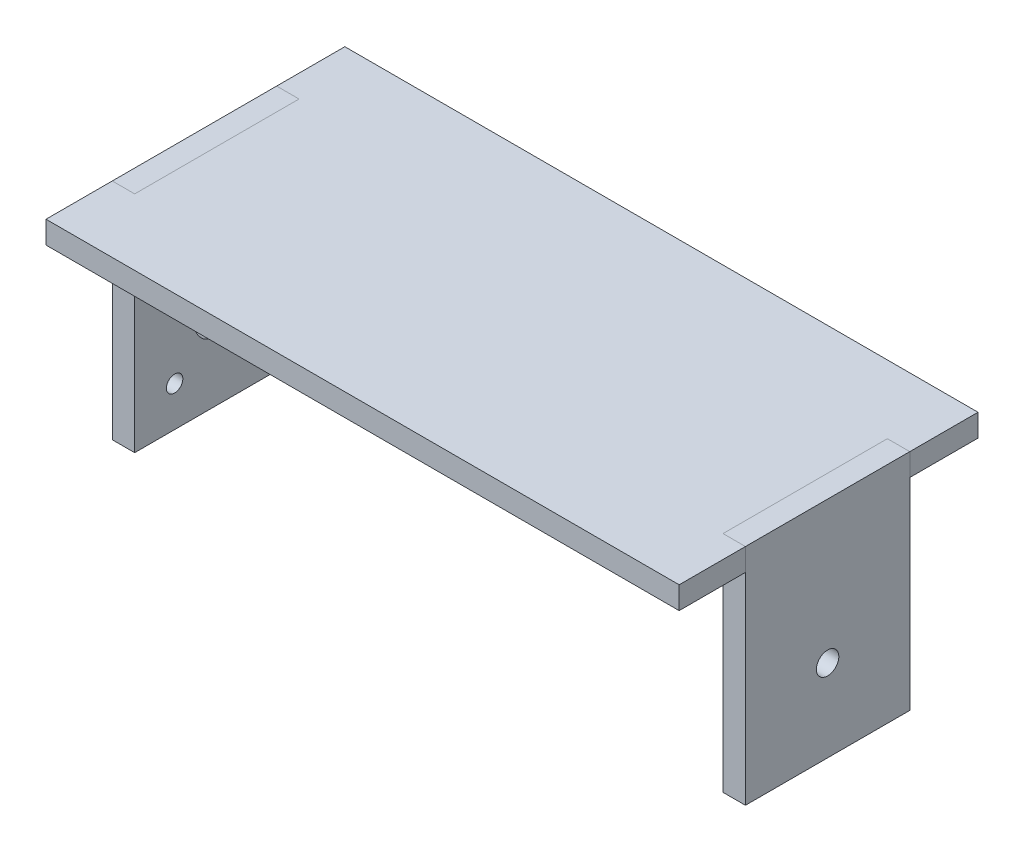
ISO-10303-21;
HEADER;
FILE_DESCRIPTION(('STEP AP214'),'2;1');
FILE_NAME('part.step','',(''),(''),'','','');
FILE_SCHEMA(('AUTOMOTIVE_DESIGN { 1 0 10303 214 1 1 1 1 }'));
ENDSEC;
DATA;
#1=APPLICATION_CONTEXT('core data for automotive mechanical design processes');
#2=APPLICATION_PROTOCOL_DEFINITION('international standard','automotive_design',2000,#1);
#3=PRODUCT_CONTEXT('',#1,'mechanical');
#4=PRODUCT('Part','Part','',(#3));
#5=PRODUCT_RELATED_PRODUCT_CATEGORY('part','',(#4));
#6=PRODUCT_DEFINITION_FORMATION('','',#4);
#7=PRODUCT_DEFINITION_CONTEXT('part definition',#1,'design');
#8=PRODUCT_DEFINITION('design','',#6,#7);
#9=PRODUCT_DEFINITION_SHAPE('','',#8);
#10=(LENGTH_UNIT() NAMED_UNIT(*) SI_UNIT(.MILLI.,.METRE.));
#11=(NAMED_UNIT(*) PLANE_ANGLE_UNIT() SI_UNIT($,.RADIAN.));
#12=(NAMED_UNIT(*) SI_UNIT($,.STERADIAN.) SOLID_ANGLE_UNIT());
#13=UNCERTAINTY_MEASURE_WITH_UNIT(LENGTH_MEASURE(1.E-05),#10,'distance_accuracy_value','');
#14=(GEOMETRIC_REPRESENTATION_CONTEXT(3) GLOBAL_UNCERTAINTY_ASSIGNED_CONTEXT((#13)) GLOBAL_UNIT_ASSIGNED_CONTEXT((#10,
#11,#12)) REPRESENTATION_CONTEXT('',''));
#15=CARTESIAN_POINT('',(0.,0.,0.));
#16=DIRECTION('',(0.,0.,1.));
#17=DIRECTION('',(1.,0.,0.));
#18=AXIS2_PLACEMENT_3D('',#15,#16,#17);
#19=CARTESIAN_POINT('',(0.,-30.,11.));
#20=DIRECTION('',(0.,0.,1.));
#21=DIRECTION('',(-1.,0.,0.));
#22=AXIS2_PLACEMENT_3D('',#19,#20,#21);
#23=PLANE('',#22);
#24=DIRECTION('',(-1.,0.,0.));
#25=VECTOR('',#24,1.);
#26=CARTESIAN_POINT('',(0.,0.,11.));
#27=LINE('',#26,#25);
#28=CARTESIAN_POINT('',(42.1266181229774,0.,11.));
#29=VERTEX_POINT('',#28);
#30=CARTESIAN_POINT('',(39.1266181229774,0.,11.));
#31=VERTEX_POINT('',#30);
#32=EDGE_CURVE('E110',#29,#31,#27,.T.);
#33=ORIENTED_EDGE('',*,*,#32,.T.);
#34=DIRECTION('',(0.,1.,0.));
#35=VECTOR('',#34,1.);
#36=CARTESIAN_POINT('',(39.1266181229774,-30.,11.));
#37=LINE('',#36,#35);
#38=CARTESIAN_POINT('',(39.1266181229774,-30.,11.));
#39=VERTEX_POINT('',#38);
#40=EDGE_CURVE('E49',#39,#31,#37,.T.);
#41=ORIENTED_EDGE('',*,*,#40,.F.);
#42=DIRECTION('',(-1.,0.,0.));
#43=VECTOR('',#42,1.);
#44=CARTESIAN_POINT('',(0.,-30.,11.));
#45=LINE('',#44,#43);
#46=CARTESIAN_POINT('',(42.1266181229774,-30.,11.));
#47=VERTEX_POINT('',#46);
#48=EDGE_CURVE('E99',#47,#39,#45,.T.);
#49=ORIENTED_EDGE('',*,*,#48,.F.);
#50=DIRECTION('',(0.,1.,0.));
#51=VECTOR('',#50,1.);
#52=CARTESIAN_POINT('',(42.1266181229774,-30.,11.));
#53=LINE('',#52,#51);
#54=EDGE_CURVE('E12',#47,#29,#53,.T.);
#55=ORIENTED_EDGE('',*,*,#54,.T.);
#56=EDGE_LOOP('',(#33,#41,#49,#55));
#57=FACE_BOUND('',#56,.T.);
#58=ADVANCED_FACE('F46',(#57),#23,.T.);
#59=CARTESIAN_POINT('',(42.1266181229774,-30.,0.));
#60=DIRECTION('',(-1.,0.,0.));
#61=DIRECTION('',(0.,0.,-1.));
#62=AXIS2_PLACEMENT_3D('',#59,#60,#61);
#63=PLANE('',#62);
#64=CARTESIAN_POINT('',(42.1266181229774,-19.,0.));
#65=DIRECTION('',(-1.,0.,0.));
#66=DIRECTION('',(0.,0.,1.));
#67=AXIS2_PLACEMENT_3D('',#64,#65,#66);
#68=CIRCLE('',#67,1.5);
#69=CARTESIAN_POINT('',(42.1266181229774,-19.,1.49999999999999));
#70=VERTEX_POINT('',#69);
#71=EDGE_CURVE('E125',#70,#70,#68,.T.);
#72=ORIENTED_EDGE('',*,*,#71,.T.);
#73=EDGE_LOOP('',(#72));
#74=FACE_BOUND('',#73,.T.);
#75=DIRECTION('',(0.,0.,-1.));
#76=VECTOR('',#75,1.);
#77=CARTESIAN_POINT('',(42.1266181229774,0.,0.));
#78=LINE('',#77,#76);
#79=CARTESIAN_POINT('',(42.1266181229774,0.,-11.));
#80=VERTEX_POINT('',#79);
#81=EDGE_CURVE('E87',#29,#80,#78,.T.);
#82=ORIENTED_EDGE('',*,*,#81,.F.);
#83=ORIENTED_EDGE('',*,*,#54,.F.);
#84=DIRECTION('',(0.,0.,-1.));
#85=VECTOR('',#84,1.);
#86=CARTESIAN_POINT('',(42.1266181229774,-30.,0.));
#87=LINE('',#86,#85);
#88=CARTESIAN_POINT('',(42.1266181229774,-30.,-11.));
#89=VERTEX_POINT('',#88);
#90=EDGE_CURVE('E64',#47,#89,#87,.T.);
#91=ORIENTED_EDGE('',*,*,#90,.T.);
#92=DIRECTION('',(0.,1.,0.));
#93=VECTOR('',#92,1.);
#94=CARTESIAN_POINT('',(42.1266181229774,-30.,-11.));
#95=LINE('',#94,#93);
#96=EDGE_CURVE('E55',#89,#80,#95,.T.);
#97=ORIENTED_EDGE('',*,*,#96,.T.);
#98=EDGE_LOOP('',(#82,#83,#91,#97));
#99=FACE_BOUND('',#98,.T.);
#100=ADVANCED_FACE('F117',(#74,#99),#63,.F.);
#101=CARTESIAN_POINT('',(0.,-30.,-11.));
#102=DIRECTION('',(0.,0.,1.));
#103=DIRECTION('',(-1.,0.,0.));
#104=AXIS2_PLACEMENT_3D('',#101,#102,#103);
#105=PLANE('',#104);
#106=DIRECTION('',(-1.,0.,0.));
#107=VECTOR('',#106,1.);
#108=CARTESIAN_POINT('',(0.,0.,-11.));
#109=LINE('',#108,#107);
#110=CARTESIAN_POINT('',(39.1266181229774,0.,-11.));
#111=VERTEX_POINT('',#110);
#112=EDGE_CURVE('E81',#80,#111,#109,.T.);
#113=ORIENTED_EDGE('',*,*,#112,.F.);
#114=ORIENTED_EDGE('',*,*,#96,.F.);
#115=DIRECTION('',(-1.,0.,0.));
#116=VECTOR('',#115,1.);
#117=CARTESIAN_POINT('',(0.,-30.,-11.));
#118=LINE('',#117,#116);
#119=CARTESIAN_POINT('',(39.1266181229774,-30.,-11.));
#120=VERTEX_POINT('',#119);
#121=EDGE_CURVE('E97',#89,#120,#118,.T.);
#122=ORIENTED_EDGE('',*,*,#121,.T.);
#123=DIRECTION('',(0.,1.,0.));
#124=VECTOR('',#123,1.);
#125=CARTESIAN_POINT('',(39.1266181229774,-30.,-11.));
#126=LINE('',#125,#124);
#127=EDGE_CURVE('E102',#120,#111,#126,.T.);
#128=ORIENTED_EDGE('',*,*,#127,.T.);
#129=EDGE_LOOP('',(#113,#114,#122,#128));
#130=FACE_BOUND('',#129,.T.);
#131=ADVANCED_FACE('F105',(#130),#105,.F.);
#132=CARTESIAN_POINT('',(39.1266181229774,-30.,0.));
#133=DIRECTION('',(-1.,0.,0.));
#134=DIRECTION('',(0.,0.,-1.));
#135=AXIS2_PLACEMENT_3D('',#132,#133,#134);
#136=PLANE('',#135);
#137=CARTESIAN_POINT('',(39.1266181229774,-19.,0.));
#138=DIRECTION('',(1.,0.,0.));
#139=DIRECTION('',(0.,0.,-1.));
#140=AXIS2_PLACEMENT_3D('',#137,#138,#139);
#141=CIRCLE('',#140,1.5);
#142=CARTESIAN_POINT('',(39.1266181229774,-19.,1.49999999999999));
#143=VERTEX_POINT('',#142);
#144=EDGE_CURVE('E113',#143,#143,#141,.F.);
#145=ORIENTED_EDGE('',*,*,#144,.F.);
#146=EDGE_LOOP('',(#145));
#147=FACE_BOUND('',#146,.T.);
#148=DIRECTION('',(0.,0.,-1.));
#149=VECTOR('',#148,1.);
#150=CARTESIAN_POINT('',(39.1266181229774,0.,0.));
#151=LINE('',#150,#149);
#152=EDGE_CURVE('E104',#31,#111,#151,.T.);
#153=ORIENTED_EDGE('',*,*,#152,.T.);
#154=ORIENTED_EDGE('',*,*,#127,.F.);
#155=DIRECTION('',(0.,0.,-1.));
#156=VECTOR('',#155,1.);
#157=CARTESIAN_POINT('',(39.1266181229774,-30.,0.));
#158=LINE('',#157,#156);
#159=EDGE_CURVE('E94',#39,#120,#158,.T.);
#160=ORIENTED_EDGE('',*,*,#159,.F.);
#161=ORIENTED_EDGE('',*,*,#40,.T.);
#162=EDGE_LOOP('',(#153,#154,#160,#161));
#163=FACE_BOUND('',#162,.T.);
#164=ADVANCED_FACE('F103',(#147,#163),#136,.T.);
#165=CARTESIAN_POINT('',(0.,-30.,0.));
#166=DIRECTION('',(0.,1.,0.));
#167=DIRECTION('',(0.,0.,-1.));
#168=AXIS2_PLACEMENT_3D('',#165,#166,#167);
#169=PLANE('',#168);
#170=ORIENTED_EDGE('',*,*,#48,.T.);
#171=ORIENTED_EDGE('',*,*,#159,.T.);
#172=ORIENTED_EDGE('',*,*,#121,.F.);
#173=ORIENTED_EDGE('',*,*,#90,.F.);
#174=EDGE_LOOP('',(#170,#171,#172,#173));
#175=FACE_BOUND('',#174,.T.);
#176=ADVANCED_FACE('F95',(#175),#169,.F.);
#177=CARTESIAN_POINT('',(0.,0.,0.));
#178=DIRECTION('',(0.,1.,0.));
#179=DIRECTION('',(0.,0.,-1.));
#180=AXIS2_PLACEMENT_3D('',#177,#178,#179);
#181=PLANE('',#180);
#182=ORIENTED_EDGE('',*,*,#32,.F.);
#183=ORIENTED_EDGE('',*,*,#81,.T.);
#184=ORIENTED_EDGE('',*,*,#112,.T.);
#185=ORIENTED_EDGE('',*,*,#152,.F.);
#186=EDGE_LOOP('',(#182,#183,#184,#185));
#187=FACE_BOUND('',#186,.T.);
#188=ADVANCED_FACE('F120',(#187),#181,.T.);
#189=CARTESIAN_POINT('',(34.8839774358581,-19.,0.));
#190=DIRECTION('',(1.,0.,0.));
#191=DIRECTION('',(0.,0.,1.));
#192=AXIS2_PLACEMENT_3D('',#189,#190,#191);
#193=CYLINDRICAL_SURFACE('',#192,1.5);
#194=CARTESIAN_POINT('',(42.1266181229774,-19.,1.49999999999999));
#195=CARTESIAN_POINT('',(42.0953681229774,-19.,1.49999999999999));
#196=CARTESIAN_POINT('',(42.0641181229774,-19.,1.49999999999999));
#197=CARTESIAN_POINT('',(42.0016181229774,-19.,1.49999999999999));
#198=CARTESIAN_POINT('',(41.9703681229774,-19.,1.49999999999999));
#199=CARTESIAN_POINT('',(41.9078681229774,-19.,1.49999999999999));
#200=CARTESIAN_POINT('',(41.8766181229774,-19.,1.49999999999999));
#201=CARTESIAN_POINT('',(41.8141181229774,-19.,1.49999999999999));
#202=CARTESIAN_POINT('',(41.7828681229774,-19.,1.49999999999999));
#203=CARTESIAN_POINT('',(41.7203681229774,-19.,1.49999999999999));
#204=CARTESIAN_POINT('',(41.6891181229774,-19.,1.49999999999999));
#205=CARTESIAN_POINT('',(41.6266181229774,-19.,1.49999999999999));
#206=CARTESIAN_POINT('',(41.5953681229774,-19.,1.49999999999999));
#207=CARTESIAN_POINT('',(41.5328681229774,-19.,1.49999999999999));
#208=CARTESIAN_POINT('',(41.5016181229774,-19.,1.49999999999999));
#209=CARTESIAN_POINT('',(41.4391181229774,-19.,1.49999999999999));
#210=CARTESIAN_POINT('',(41.4078681229774,-19.,1.49999999999999));
#211=CARTESIAN_POINT('',(41.3453681229774,-19.,1.49999999999999));
#212=CARTESIAN_POINT('',(41.3141181229774,-19.,1.49999999999999));
#213=CARTESIAN_POINT('',(41.2516181229774,-19.,1.49999999999999));
#214=CARTESIAN_POINT('',(41.2203681229774,-19.,1.49999999999999));
#215=CARTESIAN_POINT('',(41.1578681229774,-19.,1.49999999999999));
#216=CARTESIAN_POINT('',(41.1266181229774,-19.,1.49999999999999));
#217=CARTESIAN_POINT('',(41.0641181229774,-19.,1.49999999999999));
#218=CARTESIAN_POINT('',(41.0328681229774,-19.,1.49999999999999));
#219=CARTESIAN_POINT('',(40.9703681229774,-19.,1.49999999999999));
#220=CARTESIAN_POINT('',(40.9391181229774,-19.,1.49999999999999));
#221=CARTESIAN_POINT('',(40.8766181229774,-19.,1.49999999999999));
#222=CARTESIAN_POINT('',(40.8453681229774,-19.,1.49999999999999));
#223=CARTESIAN_POINT('',(40.7828681229774,-19.,1.49999999999999));
#224=CARTESIAN_POINT('',(40.7516181229774,-19.,1.49999999999999));
#225=CARTESIAN_POINT('',(40.6891181229774,-19.,1.49999999999999));
#226=CARTESIAN_POINT('',(40.6578681229774,-19.,1.49999999999999));
#227=CARTESIAN_POINT('',(40.5953681229774,-19.,1.49999999999999));
#228=CARTESIAN_POINT('',(40.5641181229774,-19.,1.49999999999999));
#229=CARTESIAN_POINT('',(40.5016181229774,-19.,1.49999999999999));
#230=CARTESIAN_POINT('',(40.4703681229774,-19.,1.49999999999999));
#231=CARTESIAN_POINT('',(40.4078681229774,-19.,1.49999999999999));
#232=CARTESIAN_POINT('',(40.3766181229774,-19.,1.49999999999999));
#233=CARTESIAN_POINT('',(40.3141181229774,-19.,1.49999999999999));
#234=CARTESIAN_POINT('',(40.2828681229774,-19.,1.49999999999999));
#235=CARTESIAN_POINT('',(40.2203681229774,-19.,1.49999999999999));
#236=CARTESIAN_POINT('',(40.1891181229774,-19.,1.49999999999999));
#237=CARTESIAN_POINT('',(40.1266181229774,-19.,1.49999999999999));
#238=CARTESIAN_POINT('',(40.0953681229774,-19.,1.49999999999999));
#239=CARTESIAN_POINT('',(40.0328681229774,-19.,1.49999999999999));
#240=CARTESIAN_POINT('',(40.0016181229774,-19.,1.49999999999999));
#241=CARTESIAN_POINT('',(39.9391181229774,-19.,1.49999999999999));
#242=CARTESIAN_POINT('',(39.9078681229774,-19.,1.49999999999999));
#243=CARTESIAN_POINT('',(39.8453681229774,-19.,1.49999999999999));
#244=CARTESIAN_POINT('',(39.8141181229774,-19.,1.49999999999999));
#245=CARTESIAN_POINT('',(39.7516181229774,-19.,1.49999999999999));
#246=CARTESIAN_POINT('',(39.7203681229774,-19.,1.49999999999999));
#247=CARTESIAN_POINT('',(39.6578681229774,-19.,1.49999999999999));
#248=CARTESIAN_POINT('',(39.6266181229774,-19.,1.49999999999999));
#249=CARTESIAN_POINT('',(39.5641181229774,-19.,1.49999999999999));
#250=CARTESIAN_POINT('',(39.5328681229774,-19.,1.49999999999999));
#251=CARTESIAN_POINT('',(39.4703681229774,-19.,1.49999999999999));
#252=CARTESIAN_POINT('',(39.4391181229774,-19.,1.49999999999999));
#253=CARTESIAN_POINT('',(39.3766181229774,-19.,1.49999999999999));
#254=CARTESIAN_POINT('',(39.3453681229774,-19.,1.49999999999999));
#255=CARTESIAN_POINT('',(39.2828681229774,-19.,1.49999999999999));
#256=CARTESIAN_POINT('',(39.2516181229774,-19.,1.49999999999999));
#257=CARTESIAN_POINT('',(39.1891181229774,-19.,1.49999999999999));
#258=CARTESIAN_POINT('',(39.1578681229774,-19.,1.49999999999999));
#259=CARTESIAN_POINT('',(39.1266181229774,-19.,1.49999999999999));
#260=B_SPLINE_CURVE_WITH_KNOTS('',3,(#194,#195,#196,#197,#198,#199,#200,#201,#202,#203,#204,
#205,#206,#207,#208,#209,#210,#211,#212,#213,#214,#215,#216,#217,#218,#219,#220,#221,#222,#223,
#224,#225,#226,#227,#228,#229,#230,#231,#232,#233,#234,#235,#236,#237,#238,#239,#240,#241,#242,
#243,#244,#245,#246,#247,#248,#249,#250,#251,#252,#253,#254,#255,#256,#257,#258,#259),
.UNSPECIFIED.,.F.,.F.,(4,2,2,2,2,2,2,2,2,2,2,2,2,2,2,2,2,2,2,2,2,2,2,2,2,2,2,2,2,2,2,2,4),(0.,
0.0937500000000036,0.1875,0.281250000000004,0.375000000000007,0.468750000000004,
0.562500000000007,0.656250000000004,0.750000000000008,0.843750000000004,0.937500000000008,
1.03125,1.12500000000001,1.21875,1.31250000000001,1.40625,1.50000000000001,1.59375000000001,
1.68750000000001,1.78125000000001,1.87500000000001,1.96875000000001,2.06250000000001,
2.15625000000001,2.25000000000001,2.34375000000001,2.43750000000001,2.53125000000001,
2.62500000000001,2.71875000000001,2.81250000000002,2.90625000000001,3.00000000000002),.UNSPECIFIED.);
#261=EDGE_CURVE('BSEAM130',#70,#143,#260,.T.);
#262=ORIENTED_EDGE('',*,*,#71,.F.);
#263=ORIENTED_EDGE('',*,*,#144,.T.);
#264=ORIENTED_EDGE('',*,*,#261,.T.);
#265=ORIENTED_EDGE('',*,*,#261,.F.);
#266=EDGE_LOOP('',(#262,#264,#263,#265));
#267=FACE_BOUND('',#266,.T.);
#268=ADVANCED_FACE('F130',(#267),#193,.F.);
#269=CLOSED_SHELL('',(#58,#100,#131,#164,#176,#188,#268));
#270=MANIFOLD_SOLID_BREP('B2',#269);
#271=CARTESIAN_POINT('',(-39.6233818770227,-30.,0.));
#272=DIRECTION('',(-1.,0.,0.));
#273=DIRECTION('',(0.,0.,-1.));
#274=AXIS2_PLACEMENT_3D('',#271,#272,#273);
#275=PLANE('',#274);
#276=CARTESIAN_POINT('',(-39.6233818770227,-13.3431457505077,5.6568542494924));
#277=DIRECTION('',(1.,0.,0.));
#278=DIRECTION('',(0.,0.,-1.));
#279=AXIS2_PLACEMENT_3D('',#276,#277,#278);
#280=CIRCLE('',#279,1.1);
#281=CARTESIAN_POINT('',(-39.6233818770227,-13.3431457505077,4.5568542494924));
#282=VERTEX_POINT('',#281);
#283=EDGE_CURVE('E292',#282,#282,#280,.F.);
#284=ORIENTED_EDGE('',*,*,#283,.T.);
#285=EDGE_LOOP('',(#284));
#286=FACE_BOUND('',#285,.T.);
#287=CARTESIAN_POINT('',(-39.6233818770227,-24.6568542494924,-5.65685424949238));
#288=DIRECTION('',(1.,0.,0.));
#289=DIRECTION('',(0.,0.,-1.));
#290=AXIS2_PLACEMENT_3D('',#287,#288,#289);
#291=CIRCLE('',#290,1.1);
#292=CARTESIAN_POINT('',(-39.6233818770227,-24.6568542494924,-6.75685424949238));
#293=VERTEX_POINT('',#292);
#294=EDGE_CURVE('E287',#293,#293,#291,.F.);
#295=ORIENTED_EDGE('',*,*,#294,.T.);
#296=EDGE_LOOP('',(#295));
#297=FACE_BOUND('',#296,.T.);
#298=CARTESIAN_POINT('',(-39.6233818770227,-13.3431457505077,-5.65685424949242));
#299=DIRECTION('',(1.,0.,0.));
#300=DIRECTION('',(0.,0.,-1.));
#301=AXIS2_PLACEMENT_3D('',#298,#299,#300);
#302=CIRCLE('',#301,1.1);
#303=CARTESIAN_POINT('',(-39.6233818770227,-13.3431457505077,-6.75685424949241));
#304=VERTEX_POINT('',#303);
#305=EDGE_CURVE('E304',#304,#304,#302,.F.);
#306=ORIENTED_EDGE('',*,*,#305,.T.);
#307=EDGE_LOOP('',(#306));
#308=FACE_BOUND('',#307,.T.);
#309=CARTESIAN_POINT('',(-39.6233818770227,-19.,0.));
#310=DIRECTION('',(1.,0.,0.));
#311=DIRECTION('',(0.,0.,-1.));
#312=AXIS2_PLACEMENT_3D('',#309,#310,#311);
#313=CIRCLE('',#312,3.);
#314=CARTESIAN_POINT('',(-39.6233818770227,-19.,-3.00000000000001));
#315=VERTEX_POINT('',#314);
#316=EDGE_CURVE('E270',#315,#315,#313,.F.);
#317=ORIENTED_EDGE('',*,*,#316,.T.);
#318=EDGE_LOOP('',(#317));
#319=FACE_BOUND('',#318,.T.);
#320=CARTESIAN_POINT('',(-39.6233818770227,-24.6568542494923,5.6568542494924));
#321=DIRECTION('',(1.,0.,0.));
#322=DIRECTION('',(0.,0.,-1.));
#323=AXIS2_PLACEMENT_3D('',#320,#321,#322);
#324=CIRCLE('',#323,1.1);
#325=CARTESIAN_POINT('',(-39.6233818770227,-24.6568542494923,4.5568542494924));
#326=VERTEX_POINT('',#325);
#327=EDGE_CURVE('E284',#326,#326,#324,.F.);
#328=ORIENTED_EDGE('',*,*,#327,.T.);
#329=EDGE_LOOP('',(#328));
#330=FACE_BOUND('',#329,.T.);
#331=DIRECTION('',(0.,0.,-1.));
#332=VECTOR('',#331,1.);
#333=CARTESIAN_POINT('',(-39.6233818770227,0.,0.));
#334=LINE('',#333,#332);
#335=CARTESIAN_POINT('',(-39.6233818770227,0.,11.));
#336=VERTEX_POINT('',#335);
#337=CARTESIAN_POINT('',(-39.6233818770227,0.,-11.));
#338=VERTEX_POINT('',#337);
#339=EDGE_CURVE('E267',#336,#338,#334,.T.);
#340=ORIENTED_EDGE('',*,*,#339,.F.);
#341=DIRECTION('',(0.,1.,0.));
#342=VECTOR('',#341,1.);
#343=CARTESIAN_POINT('',(-39.6233818770227,-30.,11.));
#344=LINE('',#343,#342);
#345=CARTESIAN_POINT('',(-39.6233818770227,-30.,11.));
#346=VERTEX_POINT('',#345);
#347=EDGE_CURVE('E206',#346,#336,#344,.T.);
#348=ORIENTED_EDGE('',*,*,#347,.F.);
#349=DIRECTION('',(0.,0.,-1.));
#350=VECTOR('',#349,1.);
#351=CARTESIAN_POINT('',(-39.6233818770227,-30.,0.));
#352=LINE('',#351,#350);
#353=CARTESIAN_POINT('',(-39.6233818770227,-30.,-11.));
#354=VERTEX_POINT('',#353);
#355=EDGE_CURVE('E256',#346,#354,#352,.T.);
#356=ORIENTED_EDGE('',*,*,#355,.T.);
#357=DIRECTION('',(0.,1.,0.));
#358=VECTOR('',#357,1.);
#359=CARTESIAN_POINT('',(-39.6233818770227,-30.,-11.));
#360=LINE('',#359,#358);
#361=EDGE_CURVE('E44',#354,#338,#360,.T.);
#362=ORIENTED_EDGE('',*,*,#361,.T.);
#363=EDGE_LOOP('',(#340,#348,#356,#362));
#364=FACE_BOUND('',#363,.T.);
#365=ADVANCED_FACE('F203',(#286,#297,#308,#319,#330,#364),#275,.F.);
#366=CARTESIAN_POINT('',(0.,-30.,-11.));
#367=DIRECTION('',(0.,0.,-1.));
#368=DIRECTION('',(1.,0.,0.));
#369=AXIS2_PLACEMENT_3D('',#366,#367,#368);
#370=PLANE('',#369);
#371=DIRECTION('',(1.,0.,0.));
#372=VECTOR('',#371,1.);
#373=CARTESIAN_POINT('',(0.,0.,-11.));
#374=LINE('',#373,#372);
#375=CARTESIAN_POINT('',(-42.6233818770227,0.,-11.));
#376=VERTEX_POINT('',#375);
#377=EDGE_CURVE('E244',#376,#338,#374,.T.);
#378=ORIENTED_EDGE('',*,*,#377,.T.);
#379=ORIENTED_EDGE('',*,*,#361,.F.);
#380=DIRECTION('',(1.,0.,0.));
#381=VECTOR('',#380,1.);
#382=CARTESIAN_POINT('',(0.,-30.,-11.));
#383=LINE('',#382,#381);
#384=CARTESIAN_POINT('',(-42.6233818770227,-30.,-11.));
#385=VERTEX_POINT('',#384);
#386=EDGE_CURVE('E221',#385,#354,#383,.T.);
#387=ORIENTED_EDGE('',*,*,#386,.F.);
#388=DIRECTION('',(0.,1.,0.));
#389=VECTOR('',#388,1.);
#390=CARTESIAN_POINT('',(-42.6233818770227,-30.,-11.));
#391=LINE('',#390,#389);
#392=EDGE_CURVE('E212',#385,#376,#391,.T.);
#393=ORIENTED_EDGE('',*,*,#392,.T.);
#394=EDGE_LOOP('',(#378,#379,#387,#393));
#395=FACE_BOUND('',#394,.T.);
#396=ADVANCED_FACE('F274',(#395),#370,.T.);
#397=CARTESIAN_POINT('',(-42.6233818770227,-30.,0.));
#398=DIRECTION('',(-1.,0.,0.));
#399=DIRECTION('',(0.,0.,-1.));
#400=AXIS2_PLACEMENT_3D('',#397,#398,#399);
#401=PLANE('',#400);
#402=CARTESIAN_POINT('',(-42.6233818770227,-13.3431457505077,5.6568542494924));
#403=DIRECTION('',(1.,0.,0.));
#404=DIRECTION('',(0.,-1.,0.));
#405=AXIS2_PLACEMENT_3D('',#402,#403,#404);
#406=CIRCLE('',#405,1.1);
#407=CARTESIAN_POINT('',(-42.6233818770227,-14.4431457505077,5.65685424949239));
#408=VERTEX_POINT('',#407);
#409=EDGE_CURVE('E296',#408,#408,#406,.T.);
#410=ORIENTED_EDGE('',*,*,#409,.T.);
#411=EDGE_LOOP('',(#410));
#412=FACE_BOUND('',#411,.T.);
#413=CARTESIAN_POINT('',(-42.6233818770227,-24.6568542494924,-5.65685424949238));
#414=DIRECTION('',(1.,0.,0.));
#415=DIRECTION('',(0.,1.,0.));
#416=AXIS2_PLACEMENT_3D('',#413,#414,#415);
#417=CIRCLE('',#416,1.1);
#418=CARTESIAN_POINT('',(-42.6233818770227,-23.5568542494924,-5.65685424949237));
#419=VERTEX_POINT('',#418);
#420=EDGE_CURVE('E301',#419,#419,#417,.T.);
#421=ORIENTED_EDGE('',*,*,#420,.T.);
#422=EDGE_LOOP('',(#421));
#423=FACE_BOUND('',#422,.T.);
#424=CARTESIAN_POINT('',(-42.6233818770227,-13.3431457505077,-5.65685424949242));
#425=DIRECTION('',(1.,0.,0.));
#426=DIRECTION('',(0.,0.,1.));
#427=AXIS2_PLACEMENT_3D('',#424,#425,#426);
#428=CIRCLE('',#427,1.1);
#429=CARTESIAN_POINT('',(-42.6233818770227,-13.3431457505077,-4.55685424949242));
#430=VERTEX_POINT('',#429);
#431=EDGE_CURVE('E295',#430,#430,#428,.T.);
#432=ORIENTED_EDGE('',*,*,#431,.T.);
#433=EDGE_LOOP('',(#432));
#434=FACE_BOUND('',#433,.T.);
#435=CARTESIAN_POINT('',(-42.6233818770227,-19.,0.));
#436=DIRECTION('',(1.,0.,0.));
#437=DIRECTION('',(0.,0.,-1.));
#438=AXIS2_PLACEMENT_3D('',#435,#436,#437);
#439=CIRCLE('',#438,3.);
#440=CARTESIAN_POINT('',(-42.6233818770227,-19.,-3.00000000000001));
#441=VERTEX_POINT('',#440);
#442=EDGE_CURVE('E283',#441,#441,#439,.T.);
#443=ORIENTED_EDGE('',*,*,#442,.T.);
#444=EDGE_LOOP('',(#443));
#445=FACE_BOUND('',#444,.T.);
#446=CARTESIAN_POINT('',(-42.6233818770227,-24.6568542494923,5.6568542494924));
#447=DIRECTION('',(1.,0.,0.));
#448=DIRECTION('',(0.,0.,-1.));
#449=AXIS2_PLACEMENT_3D('',#446,#447,#448);
#450=CIRCLE('',#449,1.1);
#451=CARTESIAN_POINT('',(-42.6233818770227,-24.6568542494923,4.5568542494924));
#452=VERTEX_POINT('',#451);
#453=EDGE_CURVE('E280',#452,#452,#450,.T.);
#454=ORIENTED_EDGE('',*,*,#453,.T.);
#455=EDGE_LOOP('',(#454));
#456=FACE_BOUND('',#455,.T.);
#457=DIRECTION('',(0.,0.,-1.));
#458=VECTOR('',#457,1.);
#459=CARTESIAN_POINT('',(-42.6233818770227,0.,0.));
#460=LINE('',#459,#458);
#461=CARTESIAN_POINT('',(-42.6233818770227,0.,11.));
#462=VERTEX_POINT('',#461);
#463=EDGE_CURVE('E238',#462,#376,#460,.T.);
#464=ORIENTED_EDGE('',*,*,#463,.T.);
#465=ORIENTED_EDGE('',*,*,#392,.F.);
#466=DIRECTION('',(0.,0.,-1.));
#467=VECTOR('',#466,1.);
#468=CARTESIAN_POINT('',(-42.6233818770227,-30.,0.));
#469=LINE('',#468,#467);
#470=CARTESIAN_POINT('',(-42.6233818770227,-30.,11.));
#471=VERTEX_POINT('',#470);
#472=EDGE_CURVE('E254',#471,#385,#469,.T.);
#473=ORIENTED_EDGE('',*,*,#472,.F.);
#474=DIRECTION('',(0.,1.,0.));
#475=VECTOR('',#474,1.);
#476=CARTESIAN_POINT('',(-42.6233818770227,-30.,11.));
#477=LINE('',#476,#475);
#478=EDGE_CURVE('E259',#471,#462,#477,.T.);
#479=ORIENTED_EDGE('',*,*,#478,.T.);
#480=EDGE_LOOP('',(#464,#465,#473,#479));
#481=FACE_BOUND('',#480,.T.);
#482=ADVANCED_FACE('F262',(#412,#423,#434,#445,#456,#481),#401,.T.);
#483=CARTESIAN_POINT('',(0.,-30.,11.));
#484=DIRECTION('',(0.,0.,-1.));
#485=DIRECTION('',(1.,0.,0.));
#486=AXIS2_PLACEMENT_3D('',#483,#484,#485);
#487=PLANE('',#486);
#488=DIRECTION('',(1.,0.,0.));
#489=VECTOR('',#488,1.);
#490=CARTESIAN_POINT('',(0.,0.,11.));
#491=LINE('',#490,#489);
#492=EDGE_CURVE('E261',#462,#336,#491,.T.);
#493=ORIENTED_EDGE('',*,*,#492,.F.);
#494=ORIENTED_EDGE('',*,*,#478,.F.);
#495=DIRECTION('',(1.,0.,0.));
#496=VECTOR('',#495,1.);
#497=CARTESIAN_POINT('',(0.,-30.,11.));
#498=LINE('',#497,#496);
#499=EDGE_CURVE('E251',#471,#346,#498,.T.);
#500=ORIENTED_EDGE('',*,*,#499,.T.);
#501=ORIENTED_EDGE('',*,*,#347,.T.);
#502=EDGE_LOOP('',(#493,#494,#500,#501));
#503=FACE_BOUND('',#502,.T.);
#504=ADVANCED_FACE('F260',(#503),#487,.F.);
#505=CARTESIAN_POINT('',(0.,-30.,0.));
#506=DIRECTION('',(0.,1.,0.));
#507=DIRECTION('',(0.,0.,-1.));
#508=AXIS2_PLACEMENT_3D('',#505,#506,#507);
#509=PLANE('',#508);
#510=ORIENTED_EDGE('',*,*,#355,.F.);
#511=ORIENTED_EDGE('',*,*,#499,.F.);
#512=ORIENTED_EDGE('',*,*,#472,.T.);
#513=ORIENTED_EDGE('',*,*,#386,.T.);
#514=EDGE_LOOP('',(#510,#511,#512,#513));
#515=FACE_BOUND('',#514,.T.);
#516=ADVANCED_FACE('F252',(#515),#509,.F.);
#517=CARTESIAN_POINT('',(0.,0.,0.));
#518=DIRECTION('',(0.,1.,0.));
#519=DIRECTION('',(0.,0.,-1.));
#520=AXIS2_PLACEMENT_3D('',#517,#518,#519);
#521=PLANE('',#520);
#522=ORIENTED_EDGE('',*,*,#339,.T.);
#523=ORIENTED_EDGE('',*,*,#377,.F.);
#524=ORIENTED_EDGE('',*,*,#463,.F.);
#525=ORIENTED_EDGE('',*,*,#492,.T.);
#526=EDGE_LOOP('',(#522,#523,#524,#525));
#527=FACE_BOUND('',#526,.T.);
#528=ADVANCED_FACE('F276',(#527),#521,.T.);
#529=CARTESIAN_POINT('',(-31.1381005027841,-24.6568542494923,5.6568542494924));
#530=DIRECTION('',(-1.,0.,0.));
#531=DIRECTION('',(0.,0.,-1.));
#532=AXIS2_PLACEMENT_3D('',#529,#530,#531);
#533=CYLINDRICAL_SURFACE('',#532,1.1);
#534=ORIENTED_EDGE('',*,*,#327,.F.);
#535=EDGE_LOOP('',(#534));
#536=FACE_BOUND('',#535,.T.);
#537=ORIENTED_EDGE('',*,*,#453,.F.);
#538=EDGE_LOOP('',(#537));
#539=FACE_BOUND('',#538,.T.);
#540=ADVANCED_FACE('F325',(#536,#539),#533,.F.);
#541=CARTESIAN_POINT('',(-31.1381005027841,-19.,0.));
#542=DIRECTION('',(-1.,0.,0.));
#543=DIRECTION('',(0.,0.,-1.));
#544=AXIS2_PLACEMENT_3D('',#541,#542,#543);
#545=CYLINDRICAL_SURFACE('',#544,3.);
#546=ORIENTED_EDGE('',*,*,#316,.F.);
#547=EDGE_LOOP('',(#546));
#548=FACE_BOUND('',#547,.T.);
#549=ORIENTED_EDGE('',*,*,#442,.F.);
#550=EDGE_LOOP('',(#549));
#551=FACE_BOUND('',#550,.T.);
#552=ADVANCED_FACE('F315',(#548,#551),#545,.F.);
#553=CARTESIAN_POINT('',(-31.1381005027841,-13.3431457505077,-5.65685424949242));
#554=DIRECTION('',(-1.,0.,0.));
#555=DIRECTION('',(0.,0.,-1.));
#556=AXIS2_PLACEMENT_3D('',#553,#554,#555);
#557=CYLINDRICAL_SURFACE('',#556,1.1);
#558=ORIENTED_EDGE('',*,*,#305,.F.);
#559=EDGE_LOOP('',(#558));
#560=FACE_BOUND('',#559,.T.);
#561=ORIENTED_EDGE('',*,*,#431,.F.);
#562=EDGE_LOOP('',(#561));
#563=FACE_BOUND('',#562,.T.);
#564=ADVANCED_FACE('F312',(#560,#563),#557,.F.);
#565=CARTESIAN_POINT('',(-31.1381005027841,-24.6568542494924,-5.65685424949238));
#566=DIRECTION('',(-1.,0.,0.));
#567=DIRECTION('',(0.,0.,-1.));
#568=AXIS2_PLACEMENT_3D('',#565,#566,#567);
#569=CYLINDRICAL_SURFACE('',#568,1.1);
#570=ORIENTED_EDGE('',*,*,#294,.F.);
#571=EDGE_LOOP('',(#570));
#572=FACE_BOUND('',#571,.T.);
#573=ORIENTED_EDGE('',*,*,#420,.F.);
#574=EDGE_LOOP('',(#573));
#575=FACE_BOUND('',#574,.T.);
#576=ADVANCED_FACE('F314',(#572,#575),#569,.F.);
#577=CARTESIAN_POINT('',(-31.1381005027841,-13.3431457505077,5.6568542494924));
#578=DIRECTION('',(-1.,0.,0.));
#579=DIRECTION('',(0.,0.,-1.));
#580=AXIS2_PLACEMENT_3D('',#577,#578,#579);
#581=CYLINDRICAL_SURFACE('',#580,1.1);
#582=ORIENTED_EDGE('',*,*,#283,.F.);
#583=EDGE_LOOP('',(#582));
#584=FACE_BOUND('',#583,.T.);
#585=ORIENTED_EDGE('',*,*,#409,.F.);
#586=EDGE_LOOP('',(#585));
#587=FACE_BOUND('',#586,.T.);
#588=ADVANCED_FACE('F322',(#584,#587),#581,.F.);
#589=CLOSED_SHELL('',(#365,#396,#482,#504,#516,#528,#540,#552,#564,#576,#588));
#590=MANIFOLD_SOLID_BREP('B6',#589);
#591=CARTESIAN_POINT('',(39.1266181229774,-3.,0.));
#592=DIRECTION('',(-1.,0.,0.));
#593=DIRECTION('',(0.,0.,-1.));
#594=AXIS2_PLACEMENT_3D('',#591,#592,#593);
#595=PLANE('',#594);
#596=DIRECTION('',(0.,0.,-1.));
#597=VECTOR('',#596,1.);
#598=CARTESIAN_POINT('',(39.1266181229774,0.,0.));
#599=LINE('',#598,#597);
#600=CARTESIAN_POINT('',(39.1266181229774,0.,11.));
#601=VERTEX_POINT('',#600);
#602=CARTESIAN_POINT('',(39.1266181229774,0.,-11.));
#603=VERTEX_POINT('',#602);
#604=EDGE_CURVE('E599',#601,#603,#599,.T.);
#605=ORIENTED_EDGE('',*,*,#604,.F.);
#606=DIRECTION('',(0.,1.,0.));
#607=VECTOR('',#606,1.);
#608=CARTESIAN_POINT('',(39.1266181229774,-3.,11.));
#609=LINE('',#608,#607);
#610=CARTESIAN_POINT('',(39.1266181229774,-3.,11.));
#611=VERTEX_POINT('',#610);
#612=EDGE_CURVE('E438',#611,#601,#609,.T.);
#613=ORIENTED_EDGE('',*,*,#612,.F.);
#614=DIRECTION('',(0.,0.,-1.));
#615=VECTOR('',#614,1.);
#616=CARTESIAN_POINT('',(39.1266181229774,-3.,0.));
#617=LINE('',#616,#615);
#618=CARTESIAN_POINT('',(39.1266181229774,-3.,-11.));
#619=VERTEX_POINT('',#618);
#620=EDGE_CURVE('E563',#611,#619,#617,.T.);
#621=ORIENTED_EDGE('',*,*,#620,.T.);
#622=DIRECTION('',(0.,1.,0.));
#623=VECTOR('',#622,1.);
#624=CARTESIAN_POINT('',(39.1266181229774,-3.,-11.));
#625=LINE('',#624,#623);
#626=EDGE_CURVE('E201',#619,#603,#625,.T.);
#627=ORIENTED_EDGE('',*,*,#626,.T.);
#628=EDGE_LOOP('',(#605,#613,#621,#627));
#629=FACE_BOUND('',#628,.T.);
#630=ADVANCED_FACE('F435',(#629),#595,.F.);
#631=CARTESIAN_POINT('',(0.,-3.,-11.));
#632=DIRECTION('',(0.,0.,1.));
#633=DIRECTION('',(-1.,0.,0.));
#634=AXIS2_PLACEMENT_3D('',#631,#632,#633);
#635=PLANE('',#634);
#636=DIRECTION('',(-1.,0.,0.));
#637=VECTOR('',#636,1.);
#638=CARTESIAN_POINT('',(0.,0.,-11.));
#639=LINE('',#638,#637);
#640=CARTESIAN_POINT('',(42.1266181229774,0.,-11.));
#641=VERTEX_POINT('',#640);
#642=EDGE_CURVE('E500',#641,#603,#639,.T.);
#643=ORIENTED_EDGE('',*,*,#642,.T.);
#644=ORIENTED_EDGE('',*,*,#626,.F.);
#645=DIRECTION('',(-1.,0.,0.));
#646=VECTOR('',#645,1.);
#647=CARTESIAN_POINT('',(0.,-3.,-11.));
#648=LINE('',#647,#646);
#649=CARTESIAN_POINT('',(42.1266181229774,-3.,-11.));
#650=VERTEX_POINT('',#649);
#651=EDGE_CURVE('E453',#650,#619,#648,.T.);
#652=ORIENTED_EDGE('',*,*,#651,.F.);
#653=DIRECTION('',(0.,1.,0.));
#654=VECTOR('',#653,1.);
#655=CARTESIAN_POINT('',(42.1266181229774,-3.,-11.));
#656=LINE('',#655,#654);
#657=EDGE_CURVE('E444',#650,#641,#656,.T.);
#658=ORIENTED_EDGE('',*,*,#657,.T.);
#659=EDGE_LOOP('',(#643,#644,#652,#658));
#660=FACE_BOUND('',#659,.T.);
#661=ADVANCED_FACE('F627',(#660),#635,.T.);
#662=CARTESIAN_POINT('',(42.1266181229774,-3.,0.));
#663=DIRECTION('',(-1.,0.,0.));
#664=DIRECTION('',(0.,0.,-1.));
#665=AXIS2_PLACEMENT_3D('',#662,#663,#664);
#666=PLANE('',#665);
#667=DIRECTION('',(0.,0.,-1.));
#668=VECTOR('',#667,1.);
#669=CARTESIAN_POINT('',(42.1266181229774,0.,0.));
#670=LINE('',#669,#668);
#671=CARTESIAN_POINT('',(42.1266181229774,0.,-20.1294498381877));
#672=VERTEX_POINT('',#671);
#673=EDGE_CURVE('E494',#641,#672,#670,.T.);
#674=ORIENTED_EDGE('',*,*,#673,.F.);
#675=ORIENTED_EDGE('',*,*,#657,.F.);
#676=DIRECTION('',(0.,0.,-1.));
#677=VECTOR('',#676,1.);
#678=CARTESIAN_POINT('',(42.1266181229774,-3.,0.));
#679=LINE('',#678,#677);
#680=CARTESIAN_POINT('',(42.1266181229774,-3.,-20.1294498381877));
#681=VERTEX_POINT('',#680);
#682=EDGE_CURVE('E537',#650,#681,#679,.T.);
#683=ORIENTED_EDGE('',*,*,#682,.T.);
#684=DIRECTION('',(0.,1.,0.));
#685=VECTOR('',#684,1.);
#686=CARTESIAN_POINT('',(42.1266181229774,-3.,-20.1294498381877));
#687=LINE('',#686,#685);
#688=EDGE_CURVE('E544',#681,#672,#687,.T.);
#689=ORIENTED_EDGE('',*,*,#688,.T.);
#690=EDGE_LOOP('',(#674,#675,#683,#689));
#691=FACE_BOUND('',#690,.T.);
#692=ADVANCED_FACE('F550',(#691),#666,.F.);
#693=CARTESIAN_POINT('',(0.,-3.,-20.1294498381877));
#694=DIRECTION('',(0.,0.,1.));
#695=DIRECTION('',(-1.,0.,0.));
#696=AXIS2_PLACEMENT_3D('',#693,#694,#695);
#697=PLANE('',#696);
#698=DIRECTION('',(-1.,0.,0.));
#699=VECTOR('',#698,1.);
#700=CARTESIAN_POINT('',(0.,0.,-20.1294498381877));
#701=LINE('',#700,#699);
#702=CARTESIAN_POINT('',(-42.6233818770227,0.,-20.1294498381877));
#703=VERTEX_POINT('',#702);
#704=EDGE_CURVE('E547',#672,#703,#701,.T.);
#705=ORIENTED_EDGE('',*,*,#704,.F.);
#706=ORIENTED_EDGE('',*,*,#688,.F.);
#707=DIRECTION('',(-1.,0.,0.));
#708=VECTOR('',#707,1.);
#709=CARTESIAN_POINT('',(0.,-3.,-20.1294498381877));
#710=LINE('',#709,#708);
#711=CARTESIAN_POINT('',(-42.6233818770227,-3.,-20.1294498381877));
#712=VERTEX_POINT('',#711);
#713=EDGE_CURVE('E533',#681,#712,#710,.T.);
#714=ORIENTED_EDGE('',*,*,#713,.T.);
#715=DIRECTION('',(0.,1.,0.));
#716=VECTOR('',#715,1.);
#717=CARTESIAN_POINT('',(-42.6233818770227,-3.,-20.1294498381877));
#718=LINE('',#717,#716);
#719=EDGE_CURVE('E548',#712,#703,#718,.T.);
#720=ORIENTED_EDGE('',*,*,#719,.T.);
#721=EDGE_LOOP('',(#705,#706,#714,#720));
#722=FACE_BOUND('',#721,.T.);
#723=ADVANCED_FACE('F545',(#722),#697,.F.);
#724=CARTESIAN_POINT('',(-42.6233818770227,-3.,0.));
#725=DIRECTION('',(-1.,0.,0.));
#726=DIRECTION('',(0.,0.,-1.));
#727=AXIS2_PLACEMENT_3D('',#724,#725,#726);
#728=PLANE('',#727);
#729=DIRECTION('',(0.,0.,-1.));
#730=VECTOR('',#729,1.);
#731=CARTESIAN_POINT('',(-42.6233818770227,0.,0.));
#732=LINE('',#731,#730);
#733=CARTESIAN_POINT('',(-42.6233818770227,0.,-11.));
#734=VERTEX_POINT('',#733);
#735=EDGE_CURVE('E610',#734,#703,#732,.T.);
#736=ORIENTED_EDGE('',*,*,#735,.T.);
#737=ORIENTED_EDGE('',*,*,#719,.F.);
#738=DIRECTION('',(0.,0.,-1.));
#739=VECTOR('',#738,1.);
#740=CARTESIAN_POINT('',(-42.6233818770227,-3.,0.));
#741=LINE('',#740,#739);
#742=CARTESIAN_POINT('',(-42.6233818770227,-3.,-11.));
#743=VERTEX_POINT('',#742);
#744=EDGE_CURVE('E539',#743,#712,#741,.T.);
#745=ORIENTED_EDGE('',*,*,#744,.F.);
#746=DIRECTION('',(0.,1.,0.));
#747=VECTOR('',#746,1.);
#748=CARTESIAN_POINT('',(-42.6233818770227,-3.,-11.));
#749=LINE('',#748,#747);
#750=EDGE_CURVE('E576',#743,#734,#749,.T.);
#751=ORIENTED_EDGE('',*,*,#750,.T.);
#752=EDGE_LOOP('',(#736,#737,#745,#751));
#753=FACE_BOUND('',#752,.T.);
#754=ADVANCED_FACE('F639',(#753),#728,.T.);
#755=CARTESIAN_POINT('',(0.,-3.,-11.));
#756=DIRECTION('',(0.,0.,-1.));
#757=DIRECTION('',(1.,0.,0.));
#758=AXIS2_PLACEMENT_3D('',#755,#756,#757);
#759=PLANE('',#758);
#760=DIRECTION('',(1.,0.,0.));
#761=VECTOR('',#760,1.);
#762=CARTESIAN_POINT('',(0.,0.,-11.));
#763=LINE('',#762,#761);
#764=CARTESIAN_POINT('',(-39.6233818770227,0.,-11.));
#765=VERTEX_POINT('',#764);
#766=EDGE_CURVE('E613',#734,#765,#763,.T.);
#767=ORIENTED_EDGE('',*,*,#766,.F.);
#768=ORIENTED_EDGE('',*,*,#750,.F.);
#769=DIRECTION('',(1.,0.,0.));
#770=VECTOR('',#769,1.);
#771=CARTESIAN_POINT('',(0.,-3.,-11.));
#772=LINE('',#771,#770);
#773=CARTESIAN_POINT('',(-39.6233818770227,-3.,-11.));
#774=VERTEX_POINT('',#773);
#775=EDGE_CURVE('E676',#743,#774,#772,.T.);
#776=ORIENTED_EDGE('',*,*,#775,.T.);
#777=DIRECTION('',(0.,1.,0.));
#778=VECTOR('',#777,1.);
#779=CARTESIAN_POINT('',(-39.6233818770227,-3.,-11.));
#780=LINE('',#779,#778);
#781=EDGE_CURVE('E579',#774,#765,#780,.T.);
#782=ORIENTED_EDGE('',*,*,#781,.T.);
#783=EDGE_LOOP('',(#767,#768,#776,#782));
#784=FACE_BOUND('',#783,.T.);
#785=ADVANCED_FACE('F642',(#784),#759,.F.);
#786=CARTESIAN_POINT('',(-39.6233818770227,-3.,0.));
#787=DIRECTION('',(-1.,0.,0.));
#788=DIRECTION('',(0.,0.,-1.));
#789=AXIS2_PLACEMENT_3D('',#786,#787,#788);
#790=PLANE('',#789);
#791=DIRECTION('',(0.,0.,-1.));
#792=VECTOR('',#791,1.);
#793=CARTESIAN_POINT('',(-39.6233818770227,0.,0.));
#794=LINE('',#793,#792);
#795=CARTESIAN_POINT('',(-39.6233818770227,0.,11.));
#796=VERTEX_POINT('',#795);
#797=EDGE_CURVE('E612',#796,#765,#794,.T.);
#798=ORIENTED_EDGE('',*,*,#797,.T.);
#799=ORIENTED_EDGE('',*,*,#781,.F.);
#800=DIRECTION('',(0.,0.,-1.));
#801=VECTOR('',#800,1.);
#802=CARTESIAN_POINT('',(-39.6233818770227,-3.,0.));
#803=LINE('',#802,#801);
#804=CARTESIAN_POINT('',(-39.6233818770227,-3.,11.));
#805=VERTEX_POINT('',#804);
#806=EDGE_CURVE('E674',#805,#774,#803,.T.);
#807=ORIENTED_EDGE('',*,*,#806,.F.);
#808=DIRECTION('',(0.,1.,0.));
#809=VECTOR('',#808,1.);
#810=CARTESIAN_POINT('',(-39.6233818770227,-3.,11.));
#811=LINE('',#810,#809);
#812=EDGE_CURVE('E582',#805,#796,#811,.T.);
#813=ORIENTED_EDGE('',*,*,#812,.T.);
#814=EDGE_LOOP('',(#798,#799,#807,#813));
#815=FACE_BOUND('',#814,.T.);
#816=ADVANCED_FACE('F646',(#815),#790,.T.);
#817=CARTESIAN_POINT('',(0.,-3.,11.));
#818=DIRECTION('',(0.,0.,-1.));
#819=DIRECTION('',(1.,0.,0.));
#820=AXIS2_PLACEMENT_3D('',#817,#818,#819);
#821=PLANE('',#820);
#822=DIRECTION('',(1.,0.,0.));
#823=VECTOR('',#822,1.);
#824=CARTESIAN_POINT('',(0.,0.,11.));
#825=LINE('',#824,#823);
#826=CARTESIAN_POINT('',(-42.6233818770227,0.,11.));
#827=VERTEX_POINT('',#826);
#828=EDGE_CURVE('E609',#827,#796,#825,.T.);
#829=ORIENTED_EDGE('',*,*,#828,.T.);
#830=ORIENTED_EDGE('',*,*,#812,.F.);
#831=DIRECTION('',(1.,0.,0.));
#832=VECTOR('',#831,1.);
#833=CARTESIAN_POINT('',(0.,-3.,11.));
#834=LINE('',#833,#832);
#835=CARTESIAN_POINT('',(-42.6233818770227,-3.,11.));
#836=VERTEX_POINT('',#835);
#837=EDGE_CURVE('E672',#836,#805,#834,.T.);
#838=ORIENTED_EDGE('',*,*,#837,.F.);
#839=DIRECTION('',(0.,1.,0.));
#840=VECTOR('',#839,1.);
#841=CARTESIAN_POINT('',(-42.6233818770227,-3.,11.));
#842=LINE('',#841,#840);
#843=EDGE_CURVE('E585',#836,#827,#842,.T.);
#844=ORIENTED_EDGE('',*,*,#843,.T.);
#845=EDGE_LOOP('',(#829,#830,#838,#844));
#846=FACE_BOUND('',#845,.T.);
#847=ADVANCED_FACE('F650',(#846),#821,.T.);
#848=CARTESIAN_POINT('',(-42.6233818770227,0.,19.8705501618123));
#849=VERTEX_POINT('',#848);
#850=EDGE_CURVE('E607',#849,#827,#732,.T.);
#851=ORIENTED_EDGE('',*,*,#850,.T.);
#852=ORIENTED_EDGE('',*,*,#843,.F.);
#853=CARTESIAN_POINT('',(-42.6233818770227,-3.,19.8705501618123));
#854=VERTEX_POINT('',#853);
#855=EDGE_CURVE('E562',#854,#836,#741,.T.);
#856=ORIENTED_EDGE('',*,*,#855,.F.);
#857=DIRECTION('',(0.,1.,0.));
#858=VECTOR('',#857,1.);
#859=CARTESIAN_POINT('',(-42.6233818770227,-3.,19.8705501618123));
#860=LINE('',#859,#858);
#861=EDGE_CURVE('E588',#854,#849,#860,.T.);
#862=ORIENTED_EDGE('',*,*,#861,.T.);
#863=EDGE_LOOP('',(#851,#852,#856,#862));
#864=FACE_BOUND('',#863,.T.);
#865=ADVANCED_FACE('F643',(#864),#728,.T.);
#866=CARTESIAN_POINT('',(0.,-3.,19.8705501618123));
#867=DIRECTION('',(0.,0.,-1.));
#868=DIRECTION('',(1.,0.,0.));
#869=AXIS2_PLACEMENT_3D('',#866,#867,#868);
#870=PLANE('',#869);
#871=DIRECTION('',(1.,0.,0.));
#872=VECTOR('',#871,1.);
#873=CARTESIAN_POINT('',(0.,0.,19.8705501618123));
#874=LINE('',#873,#872);
#875=CARTESIAN_POINT('',(42.1266181229774,0.,19.8705501618123));
#876=VERTEX_POINT('',#875);
#877=EDGE_CURVE('E604',#849,#876,#874,.T.);
#878=ORIENTED_EDGE('',*,*,#877,.F.);
#879=ORIENTED_EDGE('',*,*,#861,.F.);
#880=DIRECTION('',(1.,0.,0.));
#881=VECTOR('',#880,1.);
#882=CARTESIAN_POINT('',(0.,-3.,19.8705501618123));
#883=LINE('',#882,#881);
#884=CARTESIAN_POINT('',(42.1266181229774,-3.,19.8705501618123));
#885=VERTEX_POINT('',#884);
#886=EDGE_CURVE('E557',#854,#885,#883,.T.);
#887=ORIENTED_EDGE('',*,*,#886,.T.);
#888=DIRECTION('',(0.,1.,0.));
#889=VECTOR('',#888,1.);
#890=CARTESIAN_POINT('',(42.1266181229774,-3.,19.8705501618123));
#891=LINE('',#890,#889);
#892=EDGE_CURVE('E591',#885,#876,#891,.T.);
#893=ORIENTED_EDGE('',*,*,#892,.T.);
#894=EDGE_LOOP('',(#878,#879,#887,#893));
#895=FACE_BOUND('',#894,.T.);
#896=ADVANCED_FACE('F655',(#895),#870,.F.);
#897=CARTESIAN_POINT('',(42.1266181229774,0.,11.));
#898=VERTEX_POINT('',#897);
#899=EDGE_CURVE('E570',#876,#898,#670,.T.);
#900=ORIENTED_EDGE('',*,*,#899,.F.);
#901=ORIENTED_EDGE('',*,*,#892,.F.);
#902=CARTESIAN_POINT('',(42.1266181229774,-3.,11.));
#903=VERTEX_POINT('',#902);
#904=EDGE_CURVE('E552',#885,#903,#679,.T.);
#905=ORIENTED_EDGE('',*,*,#904,.T.);
#906=DIRECTION('',(0.,1.,0.));
#907=VECTOR('',#906,1.);
#908=CARTESIAN_POINT('',(42.1266181229774,-3.,11.));
#909=LINE('',#908,#907);
#910=EDGE_CURVE('E593',#903,#898,#909,.T.);
#911=ORIENTED_EDGE('',*,*,#910,.T.);
#912=EDGE_LOOP('',(#900,#901,#905,#911));
#913=FACE_BOUND('',#912,.T.);
#914=ADVANCED_FACE('F635',(#913),#666,.F.);
#915=CARTESIAN_POINT('',(0.,-3.,11.));
#916=DIRECTION('',(0.,0.,1.));
#917=DIRECTION('',(-1.,0.,0.));
#918=AXIS2_PLACEMENT_3D('',#915,#916,#917);
#919=PLANE('',#918);
#920=DIRECTION('',(-1.,0.,0.));
#921=VECTOR('',#920,1.);
#922=CARTESIAN_POINT('',(0.,0.,11.));
#923=LINE('',#922,#921);
#924=EDGE_CURVE('E597',#898,#601,#923,.T.);
#925=ORIENTED_EDGE('',*,*,#924,.F.);
#926=ORIENTED_EDGE('',*,*,#910,.F.);
#927=DIRECTION('',(-1.,0.,0.));
#928=VECTOR('',#927,1.);
#929=CARTESIAN_POINT('',(0.,-3.,11.));
#930=LINE('',#929,#928);
#931=EDGE_CURVE('E508',#903,#611,#930,.T.);
#932=ORIENTED_EDGE('',*,*,#931,.T.);
#933=ORIENTED_EDGE('',*,*,#612,.T.);
#934=EDGE_LOOP('',(#925,#926,#932,#933));
#935=FACE_BOUND('',#934,.T.);
#936=ADVANCED_FACE('F596',(#935),#919,.F.);
#937=CARTESIAN_POINT('',(0.,-3.,0.));
#938=DIRECTION('',(0.,1.,0.));
#939=DIRECTION('',(0.,0.,-1.));
#940=AXIS2_PLACEMENT_3D('',#937,#938,#939);
#941=PLANE('',#940);
#942=ORIENTED_EDGE('',*,*,#620,.F.);
#943=ORIENTED_EDGE('',*,*,#931,.F.);
#944=ORIENTED_EDGE('',*,*,#904,.F.);
#945=ORIENTED_EDGE('',*,*,#886,.F.);
#946=ORIENTED_EDGE('',*,*,#855,.T.);
#947=ORIENTED_EDGE('',*,*,#837,.T.);
#948=ORIENTED_EDGE('',*,*,#806,.T.);
#949=ORIENTED_EDGE('',*,*,#775,.F.);
#950=ORIENTED_EDGE('',*,*,#744,.T.);
#951=ORIENTED_EDGE('',*,*,#713,.F.);
#952=ORIENTED_EDGE('',*,*,#682,.F.);
#953=ORIENTED_EDGE('',*,*,#651,.T.);
#954=EDGE_LOOP('',(#942,#943,#944,#945,#946,#947,#948,#949,#950,#951,#952,#953));
#955=FACE_BOUND('',#954,.T.);
#956=ADVANCED_FACE('F535',(#955),#941,.F.);
#957=CARTESIAN_POINT('',(0.,0.,0.));
#958=DIRECTION('',(0.,1.,0.));
#959=DIRECTION('',(0.,0.,-1.));
#960=AXIS2_PLACEMENT_3D('',#957,#958,#959);
#961=PLANE('',#960);
#962=ORIENTED_EDGE('',*,*,#604,.T.);
#963=ORIENTED_EDGE('',*,*,#642,.F.);
#964=ORIENTED_EDGE('',*,*,#673,.T.);
#965=ORIENTED_EDGE('',*,*,#704,.T.);
#966=ORIENTED_EDGE('',*,*,#735,.F.);
#967=ORIENTED_EDGE('',*,*,#766,.T.);
#968=ORIENTED_EDGE('',*,*,#797,.F.);
#969=ORIENTED_EDGE('',*,*,#828,.F.);
#970=ORIENTED_EDGE('',*,*,#850,.F.);
#971=ORIENTED_EDGE('',*,*,#877,.T.);
#972=ORIENTED_EDGE('',*,*,#899,.T.);
#973=ORIENTED_EDGE('',*,*,#924,.T.);
#974=EDGE_LOOP('',(#962,#963,#964,#965,#966,#967,#968,#969,#970,#971,#972,#973));
#975=FACE_BOUND('',#974,.T.);
#976=ADVANCED_FACE('F618',(#975),#961,.T.);
#977=CLOSED_SHELL('',(#630,#661,#692,#723,#754,#785,#816,#847,#865,#896,#914,#936,#956,#976));
#978=MANIFOLD_SOLID_BREP('B38',#977);
#979=ADVANCED_BREP_SHAPE_REPRESENTATION('',(#18,#270,#590,#978),#14);
#980=SHAPE_DEFINITION_REPRESENTATION(#9,#979);
ENDSEC;
END-ISO-10303-21;
